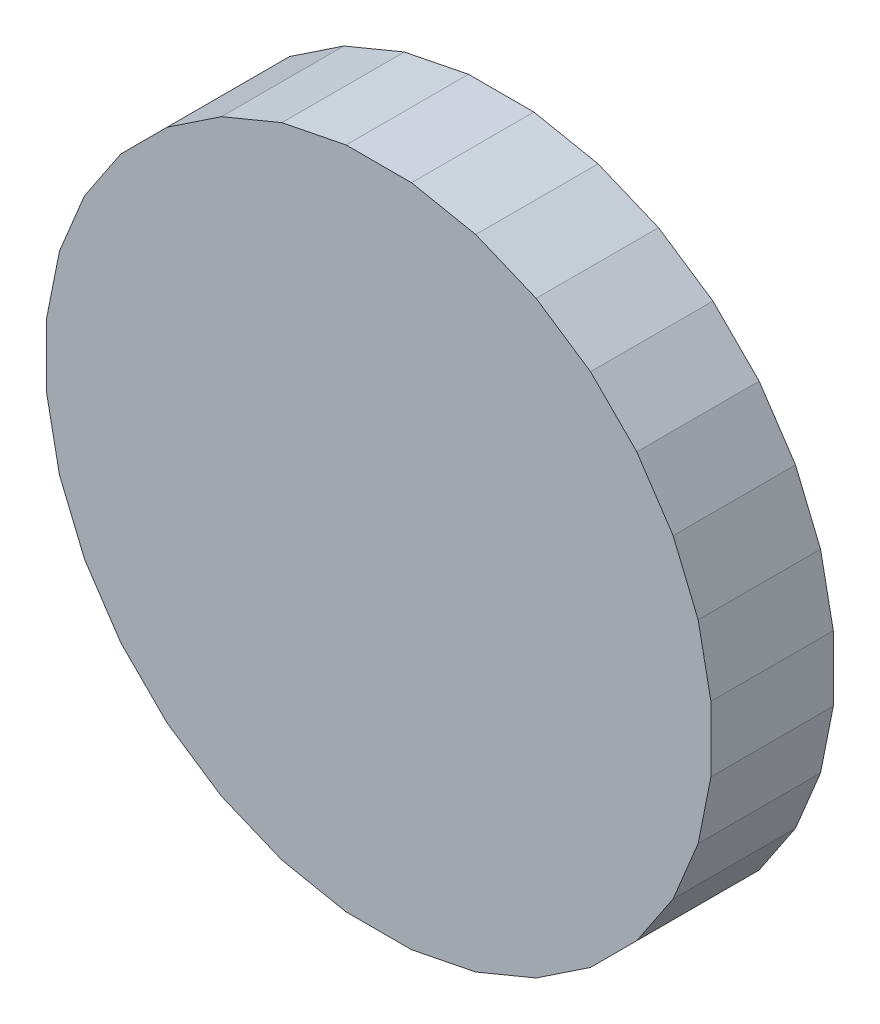
ISO-10303-21;
HEADER;
FILE_DESCRIPTION(('STEP AP214'),'2;1');
FILE_NAME('part.step','',(''),(''),'','','');
FILE_SCHEMA(('AUTOMOTIVE_DESIGN { 1 0 10303 214 1 1 1 1 }'));
ENDSEC;
DATA;
#1=APPLICATION_CONTEXT('core data for automotive mechanical design processes');
#2=APPLICATION_PROTOCOL_DEFINITION('international standard','automotive_design',2000,#1);
#3=PRODUCT_CONTEXT('',#1,'mechanical');
#4=PRODUCT('Part','Part','',(#3));
#5=PRODUCT_RELATED_PRODUCT_CATEGORY('part','',(#4));
#6=PRODUCT_DEFINITION_FORMATION('','',#4);
#7=PRODUCT_DEFINITION_CONTEXT('part definition',#1,'design');
#8=PRODUCT_DEFINITION('design','',#6,#7);
#9=PRODUCT_DEFINITION_SHAPE('','',#8);
#10=(LENGTH_UNIT() NAMED_UNIT(*) SI_UNIT(.MILLI.,.METRE.));
#11=(NAMED_UNIT(*) PLANE_ANGLE_UNIT() SI_UNIT($,.RADIAN.));
#12=(NAMED_UNIT(*) SI_UNIT($,.STERADIAN.) SOLID_ANGLE_UNIT());
#13=UNCERTAINTY_MEASURE_WITH_UNIT(LENGTH_MEASURE(1.E-05),#10,'distance_accuracy_value','');
#14=(GEOMETRIC_REPRESENTATION_CONTEXT(3) GLOBAL_UNCERTAINTY_ASSIGNED_CONTEXT((#13)) GLOBAL_UNIT_ASSIGNED_CONTEXT((#10,
#11,#12)) REPRESENTATION_CONTEXT('',''));
#15=CARTESIAN_POINT('',(0.,0.,0.));
#16=DIRECTION('',(0.,0.,1.));
#17=DIRECTION('',(1.,0.,0.));
#18=AXIS2_PLACEMENT_3D('',#15,#16,#17);
#19=CARTESIAN_POINT('',(-9.570482114027E-07,-9.570482113537E-07,0.6999986));
#20=DIRECTION('',(0.,0.,-1.));
#21=DIRECTION('',(0.,-1.,0.));
#22=AXIS2_PLACEMENT_3D('',#19,#20,#21);
#23=PLANE('',#22);
#24=DIRECTION('',(0.,-1.,0.));
#25=VECTOR('',#24,1.);
#26=CARTESIAN_POINT('',(1.89949074,0.,0.6999986));
#27=LINE('',#26,#25);
#28=CARTESIAN_POINT('',(1.89949074,0.18708116,0.6999986));
#29=VERTEX_POINT('',#28);
#30=CARTESIAN_POINT('',(1.89949074,-0.1870837,0.6999986));
#31=VERTEX_POINT('',#30);
#32=EDGE_CURVE('E47',#29,#31,#27,.T.);
#33=ORIENTED_EDGE('',*,*,#32,.F.);
#34=DIRECTION('',(0.195091243798956,-0.980785097048776,0.));
#35=VECTOR('',#34,1.);
#36=CARTESIAN_POINT('',(1.82649368,0.55406036,0.6999986));
#37=LINE('',#36,#35);
#38=CARTESIAN_POINT('',(1.82649368,0.55406036,0.6999986));
#39=VERTEX_POINT('',#38);
#40=EDGE_CURVE('E402',#39,#29,#37,.T.);
#41=ORIENTED_EDGE('',*,*,#40,.F.);
#42=DIRECTION('',(0.382684539162931,-0.923879074059833,0.));
#43=VECTOR('',#42,1.);
#44=CARTESIAN_POINT('',(1.68330626,0.8997442,0.6999986));
#45=LINE('',#44,#43);
#46=CARTESIAN_POINT('',(1.68330626,0.8997442,0.6999986));
#47=VERTEX_POINT('',#46);
#48=EDGE_CURVE('E616',#47,#39,#45,.T.);
#49=ORIENTED_EDGE('',*,*,#48,.F.);
#50=DIRECTION('',(0.555569330597158,-0.831470215281237,0.));
#51=VECTOR('',#50,1.);
#52=CARTESIAN_POINT('',(1.47543012,1.21085356,0.6999986));
#53=LINE('',#52,#51);
#54=CARTESIAN_POINT('',(1.47543012,1.21085356,0.6999986));
#55=VERTEX_POINT('',#54);
#56=EDGE_CURVE('E580',#55,#47,#53,.T.);
#57=ORIENTED_EDGE('',*,*,#56,.F.);
#58=DIRECTION('',(0.707106781186548,-0.707106781186548,0.));
#59=VECTOR('',#58,1.);
#60=CARTESIAN_POINT('',(1.21085356,1.47543012,0.6999986));
#61=LINE('',#60,#59);
#62=CARTESIAN_POINT('',(1.21085356,1.47543012,0.6999986));
#63=VERTEX_POINT('',#62);
#64=EDGE_CURVE('E362',#63,#55,#61,.T.);
#65=ORIENTED_EDGE('',*,*,#64,.F.);
#66=DIRECTION('',(0.831470215281237,-0.555569330597158,0.));
#67=VECTOR('',#66,1.);
#68=CARTESIAN_POINT('',(0.8997442,1.68330626,0.6999986));
#69=LINE('',#68,#67);
#70=CARTESIAN_POINT('',(0.8997442,1.68330626,0.6999986));
#71=VERTEX_POINT('',#70);
#72=EDGE_CURVE('E588',#71,#63,#69,.T.);
#73=ORIENTED_EDGE('',*,*,#72,.F.);
#74=DIRECTION('',(0.923879074059833,-0.382684539162931,0.));
#75=VECTOR('',#74,1.);
#76=CARTESIAN_POINT('',(0.55406036,1.82649368,0.6999986));
#77=LINE('',#76,#75);
#78=CARTESIAN_POINT('',(0.55406036,1.82649368,0.6999986));
#79=VERTEX_POINT('',#78);
#80=EDGE_CURVE('E525',#79,#71,#77,.T.);
#81=ORIENTED_EDGE('',*,*,#80,.F.);
#82=DIRECTION('',(0.980785097048776,-0.195091243798956,0.));
#83=VECTOR('',#82,1.);
#84=CARTESIAN_POINT('',(0.18708116,1.89949074,0.6999986));
#85=LINE('',#84,#83);
#86=CARTESIAN_POINT('',(0.18708116,1.89949074,0.6999986));
#87=VERTEX_POINT('',#86);
#88=EDGE_CURVE('E514',#87,#79,#85,.T.);
#89=ORIENTED_EDGE('',*,*,#88,.F.);
#90=DIRECTION('',(1.,0.,0.));
#91=VECTOR('',#90,1.);
#92=CARTESIAN_POINT('',(-0.1870837,1.89949074,0.6999986));
#93=LINE('',#92,#91);
#94=CARTESIAN_POINT('',(-0.1870837,1.89949074,0.6999986));
#95=VERTEX_POINT('',#94);
#96=EDGE_CURVE('E453',#95,#87,#93,.T.);
#97=ORIENTED_EDGE('',*,*,#96,.F.);
#98=DIRECTION('',(0.980785097048776,0.195091243798956,0.));
#99=VECTOR('',#98,1.);
#100=CARTESIAN_POINT('',(-0.5540629,1.82649368,0.6999986));
#101=LINE('',#100,#99);
#102=CARTESIAN_POINT('',(-0.5540629,1.82649368,0.6999986));
#103=VERTEX_POINT('',#102);
#104=EDGE_CURVE('E570',#103,#95,#101,.T.);
#105=ORIENTED_EDGE('',*,*,#104,.F.);
#106=DIRECTION('',(0.923879074059833,0.382684539162931,0.));
#107=VECTOR('',#106,1.);
#108=CARTESIAN_POINT('',(-0.89974674,1.68330626,0.6999986));
#109=LINE('',#108,#107);
#110=CARTESIAN_POINT('',(-0.89974674,1.68330626,0.6999986));
#111=VERTEX_POINT('',#110);
#112=EDGE_CURVE('E353',#111,#103,#109,.T.);
#113=ORIENTED_EDGE('',*,*,#112,.F.);
#114=DIRECTION('',(0.831470215281237,0.555569330597158,0.));
#115=VECTOR('',#114,1.);
#116=CARTESIAN_POINT('',(-1.2108561,1.47543012,0.6999986));
#117=LINE('',#116,#115);
#118=CARTESIAN_POINT('',(-1.2108561,1.47543012,0.6999986));
#119=VERTEX_POINT('',#118);
#120=EDGE_CURVE('E421',#119,#111,#117,.T.);
#121=ORIENTED_EDGE('',*,*,#120,.F.);
#122=DIRECTION('',(0.707106781186548,0.707106781186548,0.));
#123=VECTOR('',#122,1.);
#124=CARTESIAN_POINT('',(-1.47543266,1.21085356,0.6999986));
#125=LINE('',#124,#123);
#126=CARTESIAN_POINT('',(-1.47543266,1.21085356,0.6999986));
#127=VERTEX_POINT('',#126);
#128=EDGE_CURVE('E575',#127,#119,#125,.T.);
#129=ORIENTED_EDGE('',*,*,#128,.F.);
#130=DIRECTION('',(0.555569330597158,0.831470215281237,0.));
#131=VECTOR('',#130,1.);
#132=CARTESIAN_POINT('',(-1.6833088,0.8997442,0.6999986));
#133=LINE('',#132,#131);
#134=CARTESIAN_POINT('',(-1.6833088,0.8997442,0.6999986));
#135=VERTEX_POINT('',#134);
#136=EDGE_CURVE('E557',#135,#127,#133,.T.);
#137=ORIENTED_EDGE('',*,*,#136,.F.);
#138=DIRECTION('',(0.382684539162931,0.923879074059833,0.));
#139=VECTOR('',#138,1.);
#140=CARTESIAN_POINT('',(-1.82649622,0.55406036,0.6999986));
#141=LINE('',#140,#139);
#142=CARTESIAN_POINT('',(-1.82649622,0.55406036,0.6999986));
#143=VERTEX_POINT('',#142);
#144=EDGE_CURVE('E542',#143,#135,#141,.T.);
#145=ORIENTED_EDGE('',*,*,#144,.F.);
#146=DIRECTION('',(0.195084713775977,0.980786395934887,0.));
#147=VECTOR('',#146,1.);
#148=CARTESIAN_POINT('',(-1.89949074,0.18708116,0.6999986));
#149=LINE('',#148,#147);
#150=CARTESIAN_POINT('',(-1.89949074,0.18708116,0.6999986));
#151=VERTEX_POINT('',#150);
#152=EDGE_CURVE('E524',#151,#143,#149,.T.);
#153=ORIENTED_EDGE('',*,*,#152,.F.);
#154=DIRECTION('',(0.,1.,0.));
#155=VECTOR('',#154,1.);
#156=CARTESIAN_POINT('',(-1.89949074,-0.1870837,0.6999986));
#157=LINE('',#156,#155);
#158=CARTESIAN_POINT('',(-1.89949074,-0.1870837,0.6999986));
#159=VERTEX_POINT('',#158);
#160=EDGE_CURVE('E397',#159,#151,#157,.T.);
#161=ORIENTED_EDGE('',*,*,#160,.F.);
#162=DIRECTION('',(-0.195084713775977,0.980786395934887,0.));
#163=VECTOR('',#162,1.);
#164=CARTESIAN_POINT('',(-1.82649622,-0.5540629,0.6999986));
#165=LINE('',#164,#163);
#166=CARTESIAN_POINT('',(-1.82649622,-0.5540629,0.6999986));
#167=VERTEX_POINT('',#166);
#168=EDGE_CURVE('E415',#167,#159,#165,.T.);
#169=ORIENTED_EDGE('',*,*,#168,.F.);
#170=DIRECTION('',(-0.382684539162931,0.923879074059833,0.));
#171=VECTOR('',#170,1.);
#172=CARTESIAN_POINT('',(-1.6833088,-0.89974674,0.6999986));
#173=LINE('',#172,#171);
#174=CARTESIAN_POINT('',(-1.6833088,-0.89974674,0.6999986));
#175=VERTEX_POINT('',#174);
#176=EDGE_CURVE('E501',#175,#167,#173,.T.);
#177=ORIENTED_EDGE('',*,*,#176,.F.);
#178=DIRECTION('',(-0.555569330597158,0.831470215281237,0.));
#179=VECTOR('',#178,1.);
#180=CARTESIAN_POINT('',(-1.47543266,-1.2108561,0.6999986));
#181=LINE('',#180,#179);
#182=CARTESIAN_POINT('',(-1.47543266,-1.2108561,0.6999986));
#183=VERTEX_POINT('',#182);
#184=EDGE_CURVE('E343',#183,#175,#181,.T.);
#185=ORIENTED_EDGE('',*,*,#184,.F.);
#186=DIRECTION('',(-0.707106781186548,0.707106781186548,0.));
#187=VECTOR('',#186,1.);
#188=CARTESIAN_POINT('',(-1.2108561,-1.47543266,0.6999986));
#189=LINE('',#188,#187);
#190=CARTESIAN_POINT('',(-1.2108561,-1.47543266,0.6999986));
#191=VERTEX_POINT('',#190);
#192=EDGE_CURVE('E486',#191,#183,#189,.T.);
#193=ORIENTED_EDGE('',*,*,#192,.F.);
#194=DIRECTION('',(-0.831470215281237,0.555569330597158,0.));
#195=VECTOR('',#194,1.);
#196=CARTESIAN_POINT('',(-0.89974674,-1.6833088,0.6999986));
#197=LINE('',#196,#195);
#198=CARTESIAN_POINT('',(-0.89974674,-1.6833088,0.6999986));
#199=VERTEX_POINT('',#198);
#200=EDGE_CURVE('E443',#199,#191,#197,.T.);
#201=ORIENTED_EDGE('',*,*,#200,.F.);
#202=DIRECTION('',(-0.923879074059833,0.382684539162931,0.));
#203=VECTOR('',#202,1.);
#204=CARTESIAN_POINT('',(-0.5540629,-1.82649622,0.6999986));
#205=LINE('',#204,#203);
#206=CARTESIAN_POINT('',(-0.5540629,-1.82649622,0.6999986));
#207=VERTEX_POINT('',#206);
#208=EDGE_CURVE('E471',#207,#199,#205,.T.);
#209=ORIENTED_EDGE('',*,*,#208,.F.);
#210=DIRECTION('',(-0.980786395934887,0.195084713775977,0.));
#211=VECTOR('',#210,1.);
#212=CARTESIAN_POINT('',(-0.1870837,-1.89949074,0.6999986));
#213=LINE('',#212,#211);
#214=CARTESIAN_POINT('',(-0.1870837,-1.89949074,0.6999986));
#215=VERTEX_POINT('',#214);
#216=EDGE_CURVE('E381',#215,#207,#213,.T.);
#217=ORIENTED_EDGE('',*,*,#216,.F.);
#218=DIRECTION('',(-1.,0.,0.));
#219=VECTOR('',#218,1.);
#220=CARTESIAN_POINT('',(0.18708116,-1.89949074,0.6999986));
#221=LINE('',#220,#219);
#222=CARTESIAN_POINT('',(0.18708116,-1.89949074,0.6999986));
#223=VERTEX_POINT('',#222);
#224=EDGE_CURVE('E334',#223,#215,#221,.T.);
#225=ORIENTED_EDGE('',*,*,#224,.F.);
#226=DIRECTION('',(-0.980786395934887,-0.195084713775977,0.));
#227=VECTOR('',#226,1.);
#228=CARTESIAN_POINT('',(0.55406036,-1.82649622,0.6999986));
#229=LINE('',#228,#227);
#230=CARTESIAN_POINT('',(0.55406036,-1.82649622,0.6999986));
#231=VERTEX_POINT('',#230);
#232=EDGE_CURVE('E448',#231,#223,#229,.T.);
#233=ORIENTED_EDGE('',*,*,#232,.F.);
#234=DIRECTION('',(-0.923879074059833,-0.382684539162931,0.));
#235=VECTOR('',#234,1.);
#236=CARTESIAN_POINT('',(0.8997442,-1.6833088,0.6999986));
#237=LINE('',#236,#235);
#238=CARTESIAN_POINT('',(0.8997442,-1.6833088,0.6999986));
#239=VERTEX_POINT('',#238);
#240=EDGE_CURVE('E341',#239,#231,#237,.T.);
#241=ORIENTED_EDGE('',*,*,#240,.F.);
#242=DIRECTION('',(-0.831470215281237,-0.555569330597158,0.));
#243=VECTOR('',#242,1.);
#244=CARTESIAN_POINT('',(1.21085356,-1.47543266,0.6999986));
#245=LINE('',#244,#243);
#246=CARTESIAN_POINT('',(1.21085356,-1.47543266,0.6999986));
#247=VERTEX_POINT('',#246);
#248=EDGE_CURVE('E327',#247,#239,#245,.T.);
#249=ORIENTED_EDGE('',*,*,#248,.F.);
#250=DIRECTION('',(-0.707106781186548,-0.707106781186548,0.));
#251=VECTOR('',#250,1.);
#252=CARTESIAN_POINT('',(1.47543012,-1.2108561,0.6999986));
#253=LINE('',#252,#251);
#254=CARTESIAN_POINT('',(1.47543012,-1.2108561,0.6999986));
#255=VERTEX_POINT('',#254);
#256=EDGE_CURVE('E420',#255,#247,#253,.T.);
#257=ORIENTED_EDGE('',*,*,#256,.F.);
#258=DIRECTION('',(-0.555569330597158,-0.831470215281237,0.));
#259=VECTOR('',#258,1.);
#260=CARTESIAN_POINT('',(1.68330626,-0.89974674,0.6999986));
#261=LINE('',#260,#259);
#262=CARTESIAN_POINT('',(1.68330626,-0.89974674,0.6999986));
#263=VERTEX_POINT('',#262);
#264=EDGE_CURVE('E371',#263,#255,#261,.T.);
#265=ORIENTED_EDGE('',*,*,#264,.F.);
#266=DIRECTION('',(-0.382684539162931,-0.923879074059833,0.));
#267=VECTOR('',#266,1.);
#268=CARTESIAN_POINT('',(1.82649368,-0.5540629,0.6999986));
#269=LINE('',#268,#267);
#270=CARTESIAN_POINT('',(1.82649368,-0.5540629,0.6999986));
#271=VERTEX_POINT('',#270);
#272=EDGE_CURVE('E298',#271,#263,#269,.T.);
#273=ORIENTED_EDGE('',*,*,#272,.F.);
#274=DIRECTION('',(-0.195091243798956,-0.980785097048776,0.));
#275=VECTOR('',#274,1.);
#276=CARTESIAN_POINT('',(1.89949074,-0.1870837,0.6999986));
#277=LINE('',#276,#275);
#278=EDGE_CURVE('E295',#31,#271,#277,.T.);
#279=ORIENTED_EDGE('',*,*,#278,.F.);
#280=EDGE_LOOP('',(#33,#41,#49,#57,#65,#73,#81,#89,#97,#105,#113,#121,#129,#137,#145,#153,#161,
#169,#177,#185,#193,#201,#209,#217,#225,#233,#241,#249,#257,#265,#273,#279));
#281=FACE_BOUND('',#280,.T.);
#282=ADVANCED_FACE('F17',(#281),#23,.F.);
#283=CARTESIAN_POINT('',(-9.570482114027E-07,-9.570482113537E-07,0.));
#284=DIRECTION('',(0.,0.,-1.));
#285=DIRECTION('',(0.,-1.,0.));
#286=AXIS2_PLACEMENT_3D('',#283,#284,#285);
#287=PLANE('',#286);
#288=DIRECTION('',(0.,-1.,0.));
#289=VECTOR('',#288,1.);
#290=CARTESIAN_POINT('',(1.89949074,0.,0.));
#291=LINE('',#290,#289);
#292=CARTESIAN_POINT('',(1.89949074,0.18708116,0.));
#293=VERTEX_POINT('',#292);
#294=CARTESIAN_POINT('',(1.89949074,-0.1870837,0.));
#295=VERTEX_POINT('',#294);
#296=EDGE_CURVE('E38',#293,#295,#291,.T.);
#297=ORIENTED_EDGE('',*,*,#296,.T.);
#298=DIRECTION('',(-0.195091243798956,-0.980785097048776,0.));
#299=VECTOR('',#298,1.);
#300=CARTESIAN_POINT('',(1.89949074,-0.1870837,0.));
#301=LINE('',#300,#299);
#302=CARTESIAN_POINT('',(1.82649368,-0.5540629,0.));
#303=VERTEX_POINT('',#302);
#304=EDGE_CURVE('E308',#295,#303,#301,.T.);
#305=ORIENTED_EDGE('',*,*,#304,.T.);
#306=DIRECTION('',(-0.382684539162931,-0.923879074059833,0.));
#307=VECTOR('',#306,1.);
#308=CARTESIAN_POINT('',(1.82649368,-0.5540629,0.));
#309=LINE('',#308,#307);
#310=CARTESIAN_POINT('',(1.68330626,-0.89974674,0.));
#311=VERTEX_POINT('',#310);
#312=EDGE_CURVE('E389',#303,#311,#309,.T.);
#313=ORIENTED_EDGE('',*,*,#312,.T.);
#314=DIRECTION('',(-0.555569330597158,-0.831470215281237,0.));
#315=VECTOR('',#314,1.);
#316=CARTESIAN_POINT('',(1.68330626,-0.89974674,0.));
#317=LINE('',#316,#315);
#318=CARTESIAN_POINT('',(1.47543012,-1.2108561,0.));
#319=VERTEX_POINT('',#318);
#320=EDGE_CURVE('E322',#311,#319,#317,.T.);
#321=ORIENTED_EDGE('',*,*,#320,.T.);
#322=DIRECTION('',(-0.707106781186548,-0.707106781186548,0.));
#323=VECTOR('',#322,1.);
#324=CARTESIAN_POINT('',(1.47543012,-1.2108561,0.));
#325=LINE('',#324,#323);
#326=CARTESIAN_POINT('',(1.21085356,-1.47543266,0.));
#327=VERTEX_POINT('',#326);
#328=EDGE_CURVE('E324',#319,#327,#325,.T.);
#329=ORIENTED_EDGE('',*,*,#328,.T.);
#330=DIRECTION('',(-0.831470215281237,-0.555569330597158,0.));
#331=VECTOR('',#330,1.);
#332=CARTESIAN_POINT('',(1.21085356,-1.47543266,0.));
#333=LINE('',#332,#331);
#334=CARTESIAN_POINT('',(0.8997442,-1.6833088,0.));
#335=VERTEX_POINT('',#334);
#336=EDGE_CURVE('E429',#327,#335,#333,.T.);
#337=ORIENTED_EDGE('',*,*,#336,.T.);
#338=DIRECTION('',(-0.923879074059833,-0.382684539162931,0.));
#339=VECTOR('',#338,1.);
#340=CARTESIAN_POINT('',(0.8997442,-1.6833088,0.));
#341=LINE('',#340,#339);
#342=CARTESIAN_POINT('',(0.55406036,-1.82649622,0.));
#343=VERTEX_POINT('',#342);
#344=EDGE_CURVE('E340',#335,#343,#341,.T.);
#345=ORIENTED_EDGE('',*,*,#344,.T.);
#346=DIRECTION('',(-0.980786395934887,-0.195084713775977,0.));
#347=VECTOR('',#346,1.);
#348=CARTESIAN_POINT('',(0.55406036,-1.82649622,0.));
#349=LINE('',#348,#347);
#350=CARTESIAN_POINT('',(0.18708116,-1.89949074,0.));
#351=VERTEX_POINT('',#350);
#352=EDGE_CURVE('E330',#343,#351,#349,.T.);
#353=ORIENTED_EDGE('',*,*,#352,.T.);
#354=DIRECTION('',(-1.,0.,0.));
#355=VECTOR('',#354,1.);
#356=CARTESIAN_POINT('',(0.18708116,-1.89949074,0.));
#357=LINE('',#356,#355);
#358=CARTESIAN_POINT('',(-0.1870837,-1.89949074,0.));
#359=VERTEX_POINT('',#358);
#360=EDGE_CURVE('E363',#351,#359,#357,.T.);
#361=ORIENTED_EDGE('',*,*,#360,.T.);
#362=DIRECTION('',(-0.980786395934887,0.195084713775977,0.));
#363=VECTOR('',#362,1.);
#364=CARTESIAN_POINT('',(-0.1870837,-1.89949074,0.));
#365=LINE('',#364,#363);
#366=CARTESIAN_POINT('',(-0.5540629,-1.82649622,0.));
#367=VERTEX_POINT('',#366);
#368=EDGE_CURVE('E467',#359,#367,#365,.T.);
#369=ORIENTED_EDGE('',*,*,#368,.T.);
#370=DIRECTION('',(-0.923879074059833,0.382684539162931,0.));
#371=VECTOR('',#370,1.);
#372=CARTESIAN_POINT('',(-0.5540629,-1.82649622,0.));
#373=LINE('',#372,#371);
#374=CARTESIAN_POINT('',(-0.89974674,-1.6833088,0.));
#375=VERTEX_POINT('',#374);
#376=EDGE_CURVE('E439',#367,#375,#373,.T.);
#377=ORIENTED_EDGE('',*,*,#376,.T.);
#378=DIRECTION('',(-0.831470215281237,0.555569330597158,0.));
#379=VECTOR('',#378,1.);
#380=CARTESIAN_POINT('',(-0.89974674,-1.6833088,0.));
#381=LINE('',#380,#379);
#382=CARTESIAN_POINT('',(-1.2108561,-1.47543266,0.));
#383=VERTEX_POINT('',#382);
#384=EDGE_CURVE('E482',#375,#383,#381,.T.);
#385=ORIENTED_EDGE('',*,*,#384,.T.);
#386=DIRECTION('',(-0.707106781186548,0.707106781186548,0.));
#387=VECTOR('',#386,1.);
#388=CARTESIAN_POINT('',(-1.2108561,-1.47543266,0.));
#389=LINE('',#388,#387);
#390=CARTESIAN_POINT('',(-1.47543266,-1.2108561,0.));
#391=VERTEX_POINT('',#390);
#392=EDGE_CURVE('E347',#383,#391,#389,.T.);
#393=ORIENTED_EDGE('',*,*,#392,.T.);
#394=DIRECTION('',(-0.555569330597158,0.831470215281237,0.));
#395=VECTOR('',#394,1.);
#396=CARTESIAN_POINT('',(-1.47543266,-1.2108561,0.));
#397=LINE('',#396,#395);
#398=CARTESIAN_POINT('',(-1.6833088,-0.89974674,0.));
#399=VERTEX_POINT('',#398);
#400=EDGE_CURVE('E497',#391,#399,#397,.T.);
#401=ORIENTED_EDGE('',*,*,#400,.T.);
#402=DIRECTION('',(-0.382684539162931,0.923879074059833,0.));
#403=VECTOR('',#402,1.);
#404=CARTESIAN_POINT('',(-1.6833088,-0.89974674,0.));
#405=LINE('',#404,#403);
#406=CARTESIAN_POINT('',(-1.82649622,-0.5540629,0.));
#407=VERTEX_POINT('',#406);
#408=EDGE_CURVE('E411',#399,#407,#405,.T.);
#409=ORIENTED_EDGE('',*,*,#408,.T.);
#410=DIRECTION('',(-0.195084713775977,0.980786395934887,0.));
#411=VECTOR('',#410,1.);
#412=CARTESIAN_POINT('',(-1.82649622,-0.5540629,0.));
#413=LINE('',#412,#411);
#414=CARTESIAN_POINT('',(-1.89949074,-0.1870837,0.));
#415=VERTEX_POINT('',#414);
#416=EDGE_CURVE('E393',#407,#415,#413,.T.);
#417=ORIENTED_EDGE('',*,*,#416,.T.);
#418=DIRECTION('',(0.,1.,0.));
#419=VECTOR('',#418,1.);
#420=CARTESIAN_POINT('',(-1.89949074,-0.1870837,0.));
#421=LINE('',#420,#419);
#422=CARTESIAN_POINT('',(-1.89949074,0.18708116,0.));
#423=VERTEX_POINT('',#422);
#424=EDGE_CURVE('E517',#415,#423,#421,.T.);
#425=ORIENTED_EDGE('',*,*,#424,.T.);
#426=DIRECTION('',(0.195084713775977,0.980786395934887,0.));
#427=VECTOR('',#426,1.);
#428=CARTESIAN_POINT('',(-1.89949074,0.18708116,0.));
#429=LINE('',#428,#427);
#430=CARTESIAN_POINT('',(-1.82649622,0.55406036,0.));
#431=VERTEX_POINT('',#430);
#432=EDGE_CURVE('E538',#423,#431,#429,.T.);
#433=ORIENTED_EDGE('',*,*,#432,.T.);
#434=DIRECTION('',(0.382684539162931,0.923879074059833,0.));
#435=VECTOR('',#434,1.);
#436=CARTESIAN_POINT('',(-1.82649622,0.55406036,0.));
#437=LINE('',#436,#435);
#438=CARTESIAN_POINT('',(-1.6833088,0.8997442,0.));
#439=VERTEX_POINT('',#438);
#440=EDGE_CURVE('E553',#431,#439,#437,.T.);
#441=ORIENTED_EDGE('',*,*,#440,.T.);
#442=DIRECTION('',(0.555569330597158,0.831470215281237,0.));
#443=VECTOR('',#442,1.);
#444=CARTESIAN_POINT('',(-1.6833088,0.8997442,0.));
#445=LINE('',#444,#443);
#446=CARTESIAN_POINT('',(-1.47543266,1.21085356,0.));
#447=VERTEX_POINT('',#446);
#448=EDGE_CURVE('E565',#439,#447,#445,.T.);
#449=ORIENTED_EDGE('',*,*,#448,.T.);
#450=DIRECTION('',(0.707106781186548,0.707106781186548,0.));
#451=VECTOR('',#450,1.);
#452=CARTESIAN_POINT('',(-1.47543266,1.21085356,0.));
#453=LINE('',#452,#451);
#454=CARTESIAN_POINT('',(-1.2108561,1.47543012,0.));
#455=VERTEX_POINT('',#454);
#456=EDGE_CURVE('E425',#447,#455,#453,.T.);
#457=ORIENTED_EDGE('',*,*,#456,.T.);
#458=DIRECTION('',(0.831470215281237,0.555569330597158,0.));
#459=VECTOR('',#458,1.);
#460=CARTESIAN_POINT('',(-1.2108561,1.47543012,0.));
#461=LINE('',#460,#459);
#462=CARTESIAN_POINT('',(-0.89974674,1.68330626,0.));
#463=VERTEX_POINT('',#462);
#464=EDGE_CURVE('E349',#455,#463,#461,.T.);
#465=ORIENTED_EDGE('',*,*,#464,.T.);
#466=DIRECTION('',(0.923879074059833,0.382684539162931,0.));
#467=VECTOR('',#466,1.);
#468=CARTESIAN_POINT('',(-0.89974674,1.68330626,0.));
#469=LINE('',#468,#467);
#470=CARTESIAN_POINT('',(-0.5540629,1.82649368,0.));
#471=VERTEX_POINT('',#470);
#472=EDGE_CURVE('E566',#463,#471,#469,.T.);
#473=ORIENTED_EDGE('',*,*,#472,.T.);
#474=DIRECTION('',(0.980785097048776,0.195091243798956,0.));
#475=VECTOR('',#474,1.);
#476=CARTESIAN_POINT('',(-0.5540629,1.82649368,0.));
#477=LINE('',#476,#475);
#478=CARTESIAN_POINT('',(-0.1870837,1.89949074,0.));
#479=VERTEX_POINT('',#478);
#480=EDGE_CURVE('E617',#471,#479,#477,.T.);
#481=ORIENTED_EDGE('',*,*,#480,.T.);
#482=DIRECTION('',(1.,0.,0.));
#483=VECTOR('',#482,1.);
#484=CARTESIAN_POINT('',(-0.1870837,1.89949074,0.));
#485=LINE('',#484,#483);
#486=CARTESIAN_POINT('',(0.18708116,1.89949074,0.));
#487=VERTEX_POINT('',#486);
#488=EDGE_CURVE('E449',#479,#487,#485,.T.);
#489=ORIENTED_EDGE('',*,*,#488,.T.);
#490=DIRECTION('',(0.980785097048776,-0.195091243798956,0.));
#491=VECTOR('',#490,1.);
#492=CARTESIAN_POINT('',(0.18708116,1.89949074,0.));
#493=LINE('',#492,#491);
#494=CARTESIAN_POINT('',(0.55406036,1.82649368,0.));
#495=VERTEX_POINT('',#494);
#496=EDGE_CURVE('E530',#487,#495,#493,.T.);
#497=ORIENTED_EDGE('',*,*,#496,.T.);
#498=DIRECTION('',(0.923879074059833,-0.382684539162931,0.));
#499=VECTOR('',#498,1.);
#500=CARTESIAN_POINT('',(0.55406036,1.82649368,0.));
#501=LINE('',#500,#499);
#502=CARTESIAN_POINT('',(0.8997442,1.68330626,0.));
#503=VERTEX_POINT('',#502);
#504=EDGE_CURVE('E599',#495,#503,#501,.T.);
#505=ORIENTED_EDGE('',*,*,#504,.T.);
#506=DIRECTION('',(0.831470215281237,-0.555569330597158,0.));
#507=VECTOR('',#506,1.);
#508=CARTESIAN_POINT('',(0.8997442,1.68330626,0.));
#509=LINE('',#508,#507);
#510=CARTESIAN_POINT('',(1.21085356,1.47543012,0.));
#511=VERTEX_POINT('',#510);
#512=EDGE_CURVE('E406',#503,#511,#509,.T.);
#513=ORIENTED_EDGE('',*,*,#512,.T.);
#514=DIRECTION('',(0.707106781186548,-0.707106781186548,0.));
#515=VECTOR('',#514,1.);
#516=CARTESIAN_POINT('',(1.21085356,1.47543012,0.));
#517=LINE('',#516,#515);
#518=CARTESIAN_POINT('',(1.47543012,1.21085356,0.));
#519=VERTEX_POINT('',#518);
#520=EDGE_CURVE('E361',#511,#519,#517,.T.);
#521=ORIENTED_EDGE('',*,*,#520,.T.);
#522=DIRECTION('',(0.555569330597158,-0.831470215281237,0.));
#523=VECTOR('',#522,1.);
#524=CARTESIAN_POINT('',(1.47543012,1.21085356,0.));
#525=LINE('',#524,#523);
#526=CARTESIAN_POINT('',(1.68330626,0.8997442,0.));
#527=VERTEX_POINT('',#526);
#528=EDGE_CURVE('E643',#519,#527,#525,.T.);
#529=ORIENTED_EDGE('',*,*,#528,.T.);
#530=DIRECTION('',(0.382684539162931,-0.923879074059833,0.));
#531=VECTOR('',#530,1.);
#532=CARTESIAN_POINT('',(1.68330626,0.8997442,0.));
#533=LINE('',#532,#531);
#534=CARTESIAN_POINT('',(1.82649368,0.55406036,0.));
#535=VERTEX_POINT('',#534);
#536=EDGE_CURVE('E405',#527,#535,#533,.T.);
#537=ORIENTED_EDGE('',*,*,#536,.T.);
#538=DIRECTION('',(0.195091243798956,-0.980785097048776,0.));
#539=VECTOR('',#538,1.);
#540=CARTESIAN_POINT('',(1.82649368,0.55406036,0.));
#541=LINE('',#540,#539);
#542=EDGE_CURVE('E11',#535,#293,#541,.T.);
#543=ORIENTED_EDGE('',*,*,#542,.T.);
#544=EDGE_LOOP('',(#297,#305,#313,#321,#329,#337,#345,#353,#361,#369,#377,#385,#393,#401,#409,
#417,#425,#433,#441,#449,#457,#465,#473,#481,#489,#497,#505,#513,#521,#529,#537,#543));
#545=FACE_BOUND('',#544,.T.);
#546=ADVANCED_FACE('F658',(#545),#287,.T.);
#547=CARTESIAN_POINT('',(1.82649368,0.55406036,0.));
#548=DIRECTION('',(0.980785097048776,0.195091243798956,0.));
#549=DIRECTION('',(0.,0.,-1.));
#550=AXIS2_PLACEMENT_3D('',#547,#548,#549);
#551=PLANE('',#550);
#552=DIRECTION('',(0.,0.,1.));
#553=VECTOR('',#552,1.);
#554=CARTESIAN_POINT('',(1.82649368,0.55406036,0.));
#555=LINE('',#554,#553);
#556=EDGE_CURVE('E595',#535,#39,#555,.T.);
#557=ORIENTED_EDGE('',*,*,#556,.T.);
#558=ORIENTED_EDGE('',*,*,#40,.T.);
#559=DIRECTION('',(0.,0.,1.));
#560=VECTOR('',#559,1.);
#561=CARTESIAN_POINT('',(1.89949074,0.18708116,0.));
#562=LINE('',#561,#560);
#563=EDGE_CURVE('E20',#293,#29,#562,.T.);
#564=ORIENTED_EDGE('',*,*,#563,.F.);
#565=ORIENTED_EDGE('',*,*,#542,.F.);
#566=EDGE_LOOP('',(#557,#558,#564,#565));
#567=FACE_BOUND('',#566,.T.);
#568=ADVANCED_FACE('F656',(#567),#551,.T.);
#569=CARTESIAN_POINT('',(1.68330626,0.8997442,0.));
#570=DIRECTION('',(0.923879074059833,0.382684539162931,0.));
#571=DIRECTION('',(0.,0.,-1.));
#572=AXIS2_PLACEMENT_3D('',#569,#570,#571);
#573=PLANE('',#572);
#574=DIRECTION('',(0.,0.,1.));
#575=VECTOR('',#574,1.);
#576=CARTESIAN_POINT('',(1.68330626,0.8997442,0.));
#577=LINE('',#576,#575);
#578=EDGE_CURVE('E584',#527,#47,#577,.T.);
#579=ORIENTED_EDGE('',*,*,#578,.T.);
#580=ORIENTED_EDGE('',*,*,#48,.T.);
#581=ORIENTED_EDGE('',*,*,#556,.F.);
#582=ORIENTED_EDGE('',*,*,#536,.F.);
#583=EDGE_LOOP('',(#579,#580,#581,#582));
#584=FACE_BOUND('',#583,.T.);
#585=ADVANCED_FACE('F653',(#584),#573,.T.);
#586=CARTESIAN_POINT('',(1.47543012,1.21085356,0.));
#587=DIRECTION('',(0.831470215281237,0.555569330597158,0.));
#588=DIRECTION('',(0.,0.,-1.));
#589=AXIS2_PLACEMENT_3D('',#586,#587,#588);
#590=PLANE('',#589);
#591=DIRECTION('',(0.,0.,1.));
#592=VECTOR('',#591,1.);
#593=CARTESIAN_POINT('',(1.47543012,1.21085356,0.));
#594=LINE('',#593,#592);
#595=EDGE_CURVE('E357',#519,#55,#594,.T.);
#596=ORIENTED_EDGE('',*,*,#595,.T.);
#597=ORIENTED_EDGE('',*,*,#56,.T.);
#598=ORIENTED_EDGE('',*,*,#578,.F.);
#599=ORIENTED_EDGE('',*,*,#528,.F.);
#600=EDGE_LOOP('',(#596,#597,#598,#599));
#601=FACE_BOUND('',#600,.T.);
#602=ADVANCED_FACE('F661',(#601),#590,.T.);
#603=CARTESIAN_POINT('',(1.21085356,1.47543012,0.));
#604=DIRECTION('',(0.707106781186548,0.707106781186548,0.));
#605=DIRECTION('',(0.,0.,-1.));
#606=AXIS2_PLACEMENT_3D('',#603,#604,#605);
#607=PLANE('',#606);
#608=DIRECTION('',(0.,0.,1.));
#609=VECTOR('',#608,1.);
#610=CARTESIAN_POINT('',(1.21085356,1.47543012,0.));
#611=LINE('',#610,#609);
#612=EDGE_CURVE('E410',#511,#63,#611,.T.);
#613=ORIENTED_EDGE('',*,*,#612,.T.);
#614=ORIENTED_EDGE('',*,*,#64,.T.);
#615=ORIENTED_EDGE('',*,*,#595,.F.);
#616=ORIENTED_EDGE('',*,*,#520,.F.);
#617=EDGE_LOOP('',(#613,#614,#615,#616));
#618=FACE_BOUND('',#617,.T.);
#619=ADVANCED_FACE('F663',(#618),#607,.T.);
#620=CARTESIAN_POINT('',(0.8997442,1.68330626,0.));
#621=DIRECTION('',(0.555569330597158,0.831470215281237,0.));
#622=DIRECTION('',(0.,0.,-1.));
#623=AXIS2_PLACEMENT_3D('',#620,#621,#622);
#624=PLANE('',#623);
#625=DIRECTION('',(0.,0.,1.));
#626=VECTOR('',#625,1.);
#627=CARTESIAN_POINT('',(0.8997442,1.68330626,0.));
#628=LINE('',#627,#626);
#629=EDGE_CURVE('E529',#503,#71,#628,.T.);
#630=ORIENTED_EDGE('',*,*,#629,.T.);
#631=ORIENTED_EDGE('',*,*,#72,.T.);
#632=ORIENTED_EDGE('',*,*,#612,.F.);
#633=ORIENTED_EDGE('',*,*,#512,.F.);
#634=EDGE_LOOP('',(#630,#631,#632,#633));
#635=FACE_BOUND('',#634,.T.);
#636=ADVANCED_FACE('F669',(#635),#624,.T.);
#637=CARTESIAN_POINT('',(0.55406036,1.82649368,0.));
#638=DIRECTION('',(0.382684539162931,0.923879074059833,0.));
#639=DIRECTION('',(0.,0.,-1.));
#640=AXIS2_PLACEMENT_3D('',#637,#638,#639);
#641=PLANE('',#640);
#642=DIRECTION('',(0.,0.,1.));
#643=VECTOR('',#642,1.);
#644=CARTESIAN_POINT('',(0.55406036,1.82649368,0.));
#645=LINE('',#644,#643);
#646=EDGE_CURVE('E624',#495,#79,#645,.T.);
#647=ORIENTED_EDGE('',*,*,#646,.T.);
#648=ORIENTED_EDGE('',*,*,#80,.T.);
#649=ORIENTED_EDGE('',*,*,#629,.F.);
#650=ORIENTED_EDGE('',*,*,#504,.F.);
#651=EDGE_LOOP('',(#647,#648,#649,#650));
#652=FACE_BOUND('',#651,.T.);
#653=ADVANCED_FACE('F671',(#652),#641,.T.);
#654=CARTESIAN_POINT('',(0.18708116,1.89949074,0.));
#655=DIRECTION('',(0.195091243798956,0.980785097048776,0.));
#656=DIRECTION('',(0.,0.,-1.));
#657=AXIS2_PLACEMENT_3D('',#654,#655,#656);
#658=PLANE('',#657);
#659=DIRECTION('',(0.,0.,1.));
#660=VECTOR('',#659,1.);
#661=CARTESIAN_POINT('',(0.18708116,1.89949074,0.));
#662=LINE('',#661,#660);
#663=EDGE_CURVE('E452',#487,#87,#662,.T.);
#664=ORIENTED_EDGE('',*,*,#663,.T.);
#665=ORIENTED_EDGE('',*,*,#88,.T.);
#666=ORIENTED_EDGE('',*,*,#646,.F.);
#667=ORIENTED_EDGE('',*,*,#496,.F.);
#668=EDGE_LOOP('',(#664,#665,#666,#667));
#669=FACE_BOUND('',#668,.T.);
#670=ADVANCED_FACE('F677',(#669),#658,.T.);
#671=CARTESIAN_POINT('',(-0.1870837,1.89949074,0.));
#672=DIRECTION('',(0.,1.,0.));
#673=DIRECTION('',(1.,0.,0.));
#674=AXIS2_PLACEMENT_3D('',#671,#672,#673);
#675=PLANE('',#674);
#676=DIRECTION('',(0.,0.,1.));
#677=VECTOR('',#676,1.);
#678=CARTESIAN_POINT('',(-0.1870837,1.89949074,0.));
#679=LINE('',#678,#677);
#680=EDGE_CURVE('E612',#479,#95,#679,.T.);
#681=ORIENTED_EDGE('',*,*,#680,.T.);
#682=ORIENTED_EDGE('',*,*,#96,.T.);
#683=ORIENTED_EDGE('',*,*,#663,.F.);
#684=ORIENTED_EDGE('',*,*,#488,.F.);
#685=EDGE_LOOP('',(#681,#682,#683,#684));
#686=FACE_BOUND('',#685,.T.);
#687=ADVANCED_FACE('F684',(#686),#675,.T.);
#688=CARTESIAN_POINT('',(-0.5540629,1.82649368,0.));
#689=DIRECTION('',(-0.195091243798956,0.980785097048776,0.));
#690=DIRECTION('',(0.,0.,1.));
#691=AXIS2_PLACEMENT_3D('',#688,#689,#690);
#692=PLANE('',#691);
#693=DIRECTION('',(0.,0.,1.));
#694=VECTOR('',#693,1.);
#695=CARTESIAN_POINT('',(-0.5540629,1.82649368,0.));
#696=LINE('',#695,#694);
#697=EDGE_CURVE('E571',#471,#103,#696,.T.);
#698=ORIENTED_EDGE('',*,*,#697,.T.);
#699=ORIENTED_EDGE('',*,*,#104,.T.);
#700=ORIENTED_EDGE('',*,*,#680,.F.);
#701=ORIENTED_EDGE('',*,*,#480,.F.);
#702=EDGE_LOOP('',(#698,#699,#700,#701));
#703=FACE_BOUND('',#702,.T.);
#704=ADVANCED_FACE('F688',(#703),#692,.T.);
#705=CARTESIAN_POINT('',(-0.89974674,1.68330626,0.));
#706=DIRECTION('',(-0.382684539162931,0.923879074059833,0.));
#707=DIRECTION('',(0.,0.,1.));
#708=AXIS2_PLACEMENT_3D('',#705,#706,#707);
#709=PLANE('',#708);
#710=DIRECTION('',(0.,0.,1.));
#711=VECTOR('',#710,1.);
#712=CARTESIAN_POINT('',(-0.89974674,1.68330626,0.));
#713=LINE('',#712,#711);
#714=EDGE_CURVE('E354',#463,#111,#713,.T.);
#715=ORIENTED_EDGE('',*,*,#714,.T.);
#716=ORIENTED_EDGE('',*,*,#112,.T.);
#717=ORIENTED_EDGE('',*,*,#697,.F.);
#718=ORIENTED_EDGE('',*,*,#472,.F.);
#719=EDGE_LOOP('',(#715,#716,#717,#718));
#720=FACE_BOUND('',#719,.T.);
#721=ADVANCED_FACE('F691',(#720),#709,.T.);
#722=CARTESIAN_POINT('',(-1.2108561,1.47543012,0.));
#723=DIRECTION('',(-0.555569330597158,0.831470215281237,0.));
#724=DIRECTION('',(0.,0.,1.));
#725=AXIS2_PLACEMENT_3D('',#722,#723,#724);
#726=PLANE('',#725);
#727=DIRECTION('',(0.,0.,1.));
#728=VECTOR('',#727,1.);
#729=CARTESIAN_POINT('',(-1.2108561,1.47543012,0.));
#730=LINE('',#729,#728);
#731=EDGE_CURVE('E579',#455,#119,#730,.T.);
#732=ORIENTED_EDGE('',*,*,#731,.T.);
#733=ORIENTED_EDGE('',*,*,#120,.T.);
#734=ORIENTED_EDGE('',*,*,#714,.F.);
#735=ORIENTED_EDGE('',*,*,#464,.F.);
#736=EDGE_LOOP('',(#732,#733,#734,#735));
#737=FACE_BOUND('',#736,.T.);
#738=ADVANCED_FACE('F695',(#737),#726,.T.);
#739=CARTESIAN_POINT('',(-1.47543266,1.21085356,0.));
#740=DIRECTION('',(-0.707106781186548,0.707106781186548,0.));
#741=DIRECTION('',(0.,0.,1.));
#742=AXIS2_PLACEMENT_3D('',#739,#740,#741);
#743=PLANE('',#742);
#744=DIRECTION('',(0.,0.,1.));
#745=VECTOR('',#744,1.);
#746=CARTESIAN_POINT('',(-1.47543266,1.21085356,0.));
#747=LINE('',#746,#745);
#748=EDGE_CURVE('E561',#447,#127,#747,.T.);
#749=ORIENTED_EDGE('',*,*,#748,.T.);
#750=ORIENTED_EDGE('',*,*,#128,.T.);
#751=ORIENTED_EDGE('',*,*,#731,.F.);
#752=ORIENTED_EDGE('',*,*,#456,.F.);
#753=EDGE_LOOP('',(#749,#750,#751,#752));
#754=FACE_BOUND('',#753,.T.);
#755=ADVANCED_FACE('F697',(#754),#743,.T.);
#756=CARTESIAN_POINT('',(-1.6833088,0.8997442,0.));
#757=DIRECTION('',(-0.831470215281237,0.555569330597158,0.));
#758=DIRECTION('',(0.,0.,1.));
#759=AXIS2_PLACEMENT_3D('',#756,#757,#758);
#760=PLANE('',#759);
#761=DIRECTION('',(0.,0.,1.));
#762=VECTOR('',#761,1.);
#763=CARTESIAN_POINT('',(-1.6833088,0.8997442,0.));
#764=LINE('',#763,#762);
#765=EDGE_CURVE('E546',#439,#135,#764,.T.);
#766=ORIENTED_EDGE('',*,*,#765,.T.);
#767=ORIENTED_EDGE('',*,*,#136,.T.);
#768=ORIENTED_EDGE('',*,*,#748,.F.);
#769=ORIENTED_EDGE('',*,*,#448,.F.);
#770=EDGE_LOOP('',(#766,#767,#768,#769));
#771=FACE_BOUND('',#770,.T.);
#772=ADVANCED_FACE('F700',(#771),#760,.T.);
#773=CARTESIAN_POINT('',(-1.82649622,0.55406036,0.));
#774=DIRECTION('',(-0.923879074059833,0.382684539162931,0.));
#775=DIRECTION('',(0.,0.,1.));
#776=AXIS2_PLACEMENT_3D('',#773,#774,#775);
#777=PLANE('',#776);
#778=DIRECTION('',(0.,0.,1.));
#779=VECTOR('',#778,1.);
#780=CARTESIAN_POINT('',(-1.82649622,0.55406036,0.));
#781=LINE('',#780,#779);
#782=EDGE_CURVE('E534',#431,#143,#781,.T.);
#783=ORIENTED_EDGE('',*,*,#782,.T.);
#784=ORIENTED_EDGE('',*,*,#144,.T.);
#785=ORIENTED_EDGE('',*,*,#765,.F.);
#786=ORIENTED_EDGE('',*,*,#440,.F.);
#787=EDGE_LOOP('',(#783,#784,#785,#786));
#788=FACE_BOUND('',#787,.T.);
#789=ADVANCED_FACE('F705',(#788),#777,.T.);
#790=CARTESIAN_POINT('',(-1.89949074,0.18708116,0.));
#791=DIRECTION('',(-0.980786395934887,0.195084713775977,0.));
#792=DIRECTION('',(0.,0.,1.));
#793=AXIS2_PLACEMENT_3D('',#790,#791,#792);
#794=PLANE('',#793);
#795=DIRECTION('',(0.,0.,1.));
#796=VECTOR('',#795,1.);
#797=CARTESIAN_POINT('',(-1.89949074,0.18708116,0.));
#798=LINE('',#797,#796);
#799=EDGE_CURVE('E520',#423,#151,#798,.T.);
#800=ORIENTED_EDGE('',*,*,#799,.T.);
#801=ORIENTED_EDGE('',*,*,#152,.T.);
#802=ORIENTED_EDGE('',*,*,#782,.F.);
#803=ORIENTED_EDGE('',*,*,#432,.F.);
#804=EDGE_LOOP('',(#800,#801,#802,#803));
#805=FACE_BOUND('',#804,.T.);
#806=ADVANCED_FACE('F708',(#805),#794,.T.);
#807=CARTESIAN_POINT('',(-1.89949074,-0.1870837,0.));
#808=DIRECTION('',(-1.,0.,0.));
#809=DIRECTION('',(0.,0.,1.));
#810=AXIS2_PLACEMENT_3D('',#807,#808,#809);
#811=PLANE('',#810);
#812=DIRECTION('',(0.,0.,1.));
#813=VECTOR('',#812,1.);
#814=CARTESIAN_POINT('',(-1.89949074,-0.1870837,0.));
#815=LINE('',#814,#813);
#816=EDGE_CURVE('E398',#415,#159,#815,.T.);
#817=ORIENTED_EDGE('',*,*,#816,.T.);
#818=ORIENTED_EDGE('',*,*,#160,.T.);
#819=ORIENTED_EDGE('',*,*,#799,.F.);
#820=ORIENTED_EDGE('',*,*,#424,.F.);
#821=EDGE_LOOP('',(#817,#818,#819,#820));
#822=FACE_BOUND('',#821,.T.);
#823=ADVANCED_FACE('F711',(#822),#811,.T.);
#824=CARTESIAN_POINT('',(-1.82649622,-0.5540629,0.));
#825=DIRECTION('',(-0.980786395934887,-0.195084713775977,0.));
#826=DIRECTION('',(-0.195084713775977,0.980786395934887,0.));
#827=AXIS2_PLACEMENT_3D('',#824,#825,#826);
#828=PLANE('',#827);
#829=DIRECTION('',(0.,0.,1.));
#830=VECTOR('',#829,1.);
#831=CARTESIAN_POINT('',(-1.82649622,-0.5540629,0.));
#832=LINE('',#831,#830);
#833=EDGE_CURVE('E416',#407,#167,#832,.T.);
#834=ORIENTED_EDGE('',*,*,#833,.T.);
#835=ORIENTED_EDGE('',*,*,#168,.T.);
#836=ORIENTED_EDGE('',*,*,#816,.F.);
#837=ORIENTED_EDGE('',*,*,#416,.F.);
#838=EDGE_LOOP('',(#834,#835,#836,#837));
#839=FACE_BOUND('',#838,.T.);
#840=ADVANCED_FACE('F715',(#839),#828,.T.);
#841=CARTESIAN_POINT('',(-1.6833088,-0.89974674,0.));
#842=DIRECTION('',(-0.923879074059833,-0.382684539162931,0.));
#843=DIRECTION('',(-0.382684539162931,0.923879074059833,0.));
#844=AXIS2_PLACEMENT_3D('',#841,#842,#843);
#845=PLANE('',#844);
#846=DIRECTION('',(0.,0.,1.));
#847=VECTOR('',#846,1.);
#848=CARTESIAN_POINT('',(-1.6833088,-0.89974674,0.));
#849=LINE('',#848,#847);
#850=EDGE_CURVE('E346',#399,#175,#849,.T.);
#851=ORIENTED_EDGE('',*,*,#850,.T.);
#852=ORIENTED_EDGE('',*,*,#176,.T.);
#853=ORIENTED_EDGE('',*,*,#833,.F.);
#854=ORIENTED_EDGE('',*,*,#408,.F.);
#855=EDGE_LOOP('',(#851,#852,#853,#854));
#856=FACE_BOUND('',#855,.T.);
#857=ADVANCED_FACE('F717',(#856),#845,.T.);
#858=CARTESIAN_POINT('',(-1.47543266,-1.2108561,0.));
#859=DIRECTION('',(-0.831470215281237,-0.555569330597158,0.));
#860=DIRECTION('',(-0.555569330597158,0.831470215281237,0.));
#861=AXIS2_PLACEMENT_3D('',#858,#859,#860);
#862=PLANE('',#861);
#863=DIRECTION('',(0.,0.,1.));
#864=VECTOR('',#863,1.);
#865=CARTESIAN_POINT('',(-1.47543266,-1.2108561,0.));
#866=LINE('',#865,#864);
#867=EDGE_CURVE('E490',#391,#183,#866,.T.);
#868=ORIENTED_EDGE('',*,*,#867,.T.);
#869=ORIENTED_EDGE('',*,*,#184,.T.);
#870=ORIENTED_EDGE('',*,*,#850,.F.);
#871=ORIENTED_EDGE('',*,*,#400,.F.);
#872=EDGE_LOOP('',(#868,#869,#870,#871));
#873=FACE_BOUND('',#872,.T.);
#874=ADVANCED_FACE('F720',(#873),#862,.T.);
#875=CARTESIAN_POINT('',(-1.2108561,-1.47543266,0.));
#876=DIRECTION('',(-0.707106781186548,-0.707106781186548,0.));
#877=DIRECTION('',(-0.707106781186548,0.707106781186548,0.));
#878=AXIS2_PLACEMENT_3D('',#875,#876,#877);
#879=PLANE('',#878);
#880=DIRECTION('',(0.,0.,1.));
#881=VECTOR('',#880,1.);
#882=CARTESIAN_POINT('',(-1.2108561,-1.47543266,0.));
#883=LINE('',#882,#881);
#884=EDGE_CURVE('E478',#383,#191,#883,.T.);
#885=ORIENTED_EDGE('',*,*,#884,.T.);
#886=ORIENTED_EDGE('',*,*,#192,.T.);
#887=ORIENTED_EDGE('',*,*,#867,.F.);
#888=ORIENTED_EDGE('',*,*,#392,.F.);
#889=EDGE_LOOP('',(#885,#886,#887,#888));
#890=FACE_BOUND('',#889,.T.);
#891=ADVANCED_FACE('F725',(#890),#879,.T.);
#892=CARTESIAN_POINT('',(-0.89974674,-1.6833088,0.));
#893=DIRECTION('',(-0.555569330597158,-0.831470215281237,0.));
#894=DIRECTION('',(-0.831470215281237,0.555569330597158,0.));
#895=AXIS2_PLACEMENT_3D('',#892,#893,#894);
#896=PLANE('',#895);
#897=DIRECTION('',(0.,0.,1.));
#898=VECTOR('',#897,1.);
#899=CARTESIAN_POINT('',(-0.89974674,-1.6833088,0.));
#900=LINE('',#899,#898);
#901=EDGE_CURVE('E444',#375,#199,#900,.T.);
#902=ORIENTED_EDGE('',*,*,#901,.T.);
#903=ORIENTED_EDGE('',*,*,#200,.T.);
#904=ORIENTED_EDGE('',*,*,#884,.F.);
#905=ORIENTED_EDGE('',*,*,#384,.F.);
#906=EDGE_LOOP('',(#902,#903,#904,#905));
#907=FACE_BOUND('',#906,.T.);
#908=ADVANCED_FACE('F728',(#907),#896,.T.);
#909=CARTESIAN_POINT('',(-0.5540629,-1.82649622,0.));
#910=DIRECTION('',(-0.382684539162931,-0.923879074059833,0.));
#911=DIRECTION('',(-0.923879074059833,0.382684539162931,0.));
#912=AXIS2_PLACEMENT_3D('',#909,#910,#911);
#913=PLANE('',#912);
#914=DIRECTION('',(0.,0.,1.));
#915=VECTOR('',#914,1.);
#916=CARTESIAN_POINT('',(-0.5540629,-1.82649622,0.));
#917=LINE('',#916,#915);
#918=EDGE_CURVE('E385',#367,#207,#917,.T.);
#919=ORIENTED_EDGE('',*,*,#918,.T.);
#920=ORIENTED_EDGE('',*,*,#208,.T.);
#921=ORIENTED_EDGE('',*,*,#901,.F.);
#922=ORIENTED_EDGE('',*,*,#376,.F.);
#923=EDGE_LOOP('',(#919,#920,#921,#922));
#924=FACE_BOUND('',#923,.T.);
#925=ADVANCED_FACE('F741',(#924),#913,.T.);
#926=CARTESIAN_POINT('',(-0.1870837,-1.89949074,0.));
#927=DIRECTION('',(-0.195084713775977,-0.980786395934887,0.));
#928=DIRECTION('',(-0.980786395934887,0.195084713775977,0.));
#929=AXIS2_PLACEMENT_3D('',#926,#927,#928);
#930=PLANE('',#929);
#931=DIRECTION('',(0.,0.,1.));
#932=VECTOR('',#931,1.);
#933=CARTESIAN_POINT('',(-0.1870837,-1.89949074,0.));
#934=LINE('',#933,#932);
#935=EDGE_CURVE('E366',#359,#215,#934,.T.);
#936=ORIENTED_EDGE('',*,*,#935,.T.);
#937=ORIENTED_EDGE('',*,*,#216,.T.);
#938=ORIENTED_EDGE('',*,*,#918,.F.);
#939=ORIENTED_EDGE('',*,*,#368,.F.);
#940=EDGE_LOOP('',(#936,#937,#938,#939));
#941=FACE_BOUND('',#940,.T.);
#942=ADVANCED_FACE('F745',(#941),#930,.T.);
#943=CARTESIAN_POINT('',(0.18708116,-1.89949074,0.));
#944=DIRECTION('',(0.,-1.,0.));
#945=DIRECTION('',(0.,0.,-1.));
#946=AXIS2_PLACEMENT_3D('',#943,#944,#945);
#947=PLANE('',#946);
#948=DIRECTION('',(0.,0.,1.));
#949=VECTOR('',#948,1.);
#950=CARTESIAN_POINT('',(0.18708116,-1.89949074,0.));
#951=LINE('',#950,#949);
#952=EDGE_CURVE('E335',#351,#223,#951,.T.);
#953=ORIENTED_EDGE('',*,*,#952,.T.);
#954=ORIENTED_EDGE('',*,*,#224,.T.);
#955=ORIENTED_EDGE('',*,*,#935,.F.);
#956=ORIENTED_EDGE('',*,*,#360,.F.);
#957=EDGE_LOOP('',(#953,#954,#955,#956));
#958=FACE_BOUND('',#957,.T.);
#959=ADVANCED_FACE('F747',(#958),#947,.T.);
#960=CARTESIAN_POINT('',(0.55406036,-1.82649622,0.));
#961=DIRECTION('',(0.195084713775977,-0.980786395934887,0.));
#962=DIRECTION('',(0.,0.,-1.));
#963=AXIS2_PLACEMENT_3D('',#960,#961,#962);
#964=PLANE('',#963);
#965=DIRECTION('',(0.,0.,1.));
#966=VECTOR('',#965,1.);
#967=CARTESIAN_POINT('',(0.55406036,-1.82649622,0.));
#968=LINE('',#967,#966);
#969=EDGE_CURVE('E336',#343,#231,#968,.T.);
#970=ORIENTED_EDGE('',*,*,#969,.T.);
#971=ORIENTED_EDGE('',*,*,#232,.T.);
#972=ORIENTED_EDGE('',*,*,#952,.F.);
#973=ORIENTED_EDGE('',*,*,#352,.F.);
#974=EDGE_LOOP('',(#970,#971,#972,#973));
#975=FACE_BOUND('',#974,.T.);
#976=ADVANCED_FACE('F750',(#975),#964,.T.);
#977=CARTESIAN_POINT('',(0.8997442,-1.6833088,0.));
#978=DIRECTION('',(0.382684539162931,-0.923879074059833,0.));
#979=DIRECTION('',(0.,0.,-1.));
#980=AXIS2_PLACEMENT_3D('',#977,#978,#979);
#981=PLANE('',#980);
#982=DIRECTION('',(0.,0.,1.));
#983=VECTOR('',#982,1.);
#984=CARTESIAN_POINT('',(0.8997442,-1.6833088,0.));
#985=LINE('',#984,#983);
#986=EDGE_CURVE('E377',#335,#239,#985,.T.);
#987=ORIENTED_EDGE('',*,*,#986,.T.);
#988=ORIENTED_EDGE('',*,*,#240,.T.);
#989=ORIENTED_EDGE('',*,*,#969,.F.);
#990=ORIENTED_EDGE('',*,*,#344,.F.);
#991=EDGE_LOOP('',(#987,#988,#989,#990));
#992=FACE_BOUND('',#991,.T.);
#993=ADVANCED_FACE('F754',(#992),#981,.T.);
#994=CARTESIAN_POINT('',(1.21085356,-1.47543266,0.));
#995=DIRECTION('',(0.555569330597158,-0.831470215281237,0.));
#996=DIRECTION('',(0.,0.,-1.));
#997=AXIS2_PLACEMENT_3D('',#994,#995,#996);
#998=PLANE('',#997);
#999=DIRECTION('',(0.,0.,1.));
#1000=VECTOR('',#999,1.);
#1001=CARTESIAN_POINT('',(1.21085356,-1.47543266,0.));
#1002=LINE('',#1001,#1000);
#1003=EDGE_CURVE('E328',#327,#247,#1002,.T.);
#1004=ORIENTED_EDGE('',*,*,#1003,.T.);
#1005=ORIENTED_EDGE('',*,*,#248,.T.);
#1006=ORIENTED_EDGE('',*,*,#986,.F.);
#1007=ORIENTED_EDGE('',*,*,#336,.F.);
#1008=EDGE_LOOP('',(#1004,#1005,#1006,#1007));
#1009=FACE_BOUND('',#1008,.T.);
#1010=ADVANCED_FACE('F756',(#1009),#998,.T.);
#1011=CARTESIAN_POINT('',(1.47543012,-1.2108561,0.));
#1012=DIRECTION('',(0.707106781186548,-0.707106781186548,0.));
#1013=DIRECTION('',(0.,0.,-1.));
#1014=AXIS2_PLACEMENT_3D('',#1011,#1012,#1013);
#1015=PLANE('',#1014);
#1016=DIRECTION('',(0.,0.,1.));
#1017=VECTOR('',#1016,1.);
#1018=CARTESIAN_POINT('',(1.47543012,-1.2108561,0.));
#1019=LINE('',#1018,#1017);
#1020=EDGE_CURVE('E367',#319,#255,#1019,.T.);
#1021=ORIENTED_EDGE('',*,*,#1020,.T.);
#1022=ORIENTED_EDGE('',*,*,#256,.T.);
#1023=ORIENTED_EDGE('',*,*,#1003,.F.);
#1024=ORIENTED_EDGE('',*,*,#328,.F.);
#1025=EDGE_LOOP('',(#1021,#1022,#1023,#1024));
#1026=FACE_BOUND('',#1025,.T.);
#1027=ADVANCED_FACE('F760',(#1026),#1015,.T.);
#1028=CARTESIAN_POINT('',(1.68330626,-0.89974674,0.));
#1029=DIRECTION('',(0.831470215281237,-0.555569330597158,0.));
#1030=DIRECTION('',(0.,0.,-1.));
#1031=AXIS2_PLACEMENT_3D('',#1028,#1029,#1030);
#1032=PLANE('',#1031);
#1033=DIRECTION('',(0.,0.,1.));
#1034=VECTOR('',#1033,1.);
#1035=CARTESIAN_POINT('',(1.68330626,-0.89974674,0.));
#1036=LINE('',#1035,#1034);
#1037=EDGE_CURVE('E380',#311,#263,#1036,.T.);
#1038=ORIENTED_EDGE('',*,*,#1037,.T.);
#1039=ORIENTED_EDGE('',*,*,#264,.T.);
#1040=ORIENTED_EDGE('',*,*,#1020,.F.);
#1041=ORIENTED_EDGE('',*,*,#320,.F.);
#1042=EDGE_LOOP('',(#1038,#1039,#1040,#1041));
#1043=FACE_BOUND('',#1042,.T.);
#1044=ADVANCED_FACE('F771',(#1043),#1032,.T.);
#1045=CARTESIAN_POINT('',(1.82649368,-0.5540629,0.));
#1046=DIRECTION('',(0.923879074059833,-0.382684539162931,0.));
#1047=DIRECTION('',(0.,0.,-1.));
#1048=AXIS2_PLACEMENT_3D('',#1045,#1046,#1047);
#1049=PLANE('',#1048);
#1050=DIRECTION('',(0.,0.,1.));
#1051=VECTOR('',#1050,1.);
#1052=CARTESIAN_POINT('',(1.82649368,-0.5540629,0.));
#1053=LINE('',#1052,#1051);
#1054=EDGE_CURVE('E303',#303,#271,#1053,.T.);
#1055=ORIENTED_EDGE('',*,*,#1054,.T.);
#1056=ORIENTED_EDGE('',*,*,#272,.T.);
#1057=ORIENTED_EDGE('',*,*,#1037,.F.);
#1058=ORIENTED_EDGE('',*,*,#312,.F.);
#1059=EDGE_LOOP('',(#1055,#1056,#1057,#1058));
#1060=FACE_BOUND('',#1059,.T.);
#1061=ADVANCED_FACE('F773',(#1060),#1049,.T.);
#1062=CARTESIAN_POINT('',(1.89949074,-0.1870837,0.));
#1063=DIRECTION('',(0.980785097048776,-0.195091243798956,0.));
#1064=DIRECTION('',(0.,0.,-1.));
#1065=AXIS2_PLACEMENT_3D('',#1062,#1063,#1064);
#1066=PLANE('',#1065);
#1067=DIRECTION('',(0.,0.,1.));
#1068=VECTOR('',#1067,1.);
#1069=CARTESIAN_POINT('',(1.89949074,-0.1870837,0.));
#1070=LINE('',#1069,#1068);
#1071=EDGE_CURVE('E305',#295,#31,#1070,.T.);
#1072=ORIENTED_EDGE('',*,*,#1071,.T.);
#1073=ORIENTED_EDGE('',*,*,#278,.T.);
#1074=ORIENTED_EDGE('',*,*,#1054,.F.);
#1075=ORIENTED_EDGE('',*,*,#304,.F.);
#1076=EDGE_LOOP('',(#1072,#1073,#1074,#1075));
#1077=FACE_BOUND('',#1076,.T.);
#1078=ADVANCED_FACE('F306',(#1077),#1066,.T.);
#1079=CARTESIAN_POINT('',(1.89949074,0.,0.));
#1080=DIRECTION('',(1.,0.,0.));
#1081=DIRECTION('',(0.,1.,0.));
#1082=AXIS2_PLACEMENT_3D('',#1079,#1080,#1081);
#1083=PLANE('',#1082);
#1084=ORIENTED_EDGE('',*,*,#296,.F.);
#1085=ORIENTED_EDGE('',*,*,#563,.T.);
#1086=ORIENTED_EDGE('',*,*,#32,.T.);
#1087=ORIENTED_EDGE('',*,*,#1071,.F.);
#1088=EDGE_LOOP('',(#1084,#1085,#1086,#1087));
#1089=FACE_BOUND('',#1088,.T.);
#1090=ADVANCED_FACE('F311',(#1089),#1083,.T.);
#1091=CLOSED_SHELL('',(#282,#546,#568,#585,#602,#619,#636,#653,#670,#687,#704,#721,#738,#755,
#772,#789,#806,#823,#840,#857,#874,#891,#908,#925,#942,#959,#976,#993,#1010,#1027,#1044,#1061,
#1078,#1090));
#1092=MANIFOLD_SOLID_BREP('B1',#1091);
#1093=ADVANCED_BREP_SHAPE_REPRESENTATION('',(#18,#1092),#14);
#1094=SHAPE_DEFINITION_REPRESENTATION(#9,#1093);
ENDSEC;
END-ISO-10303-21;
